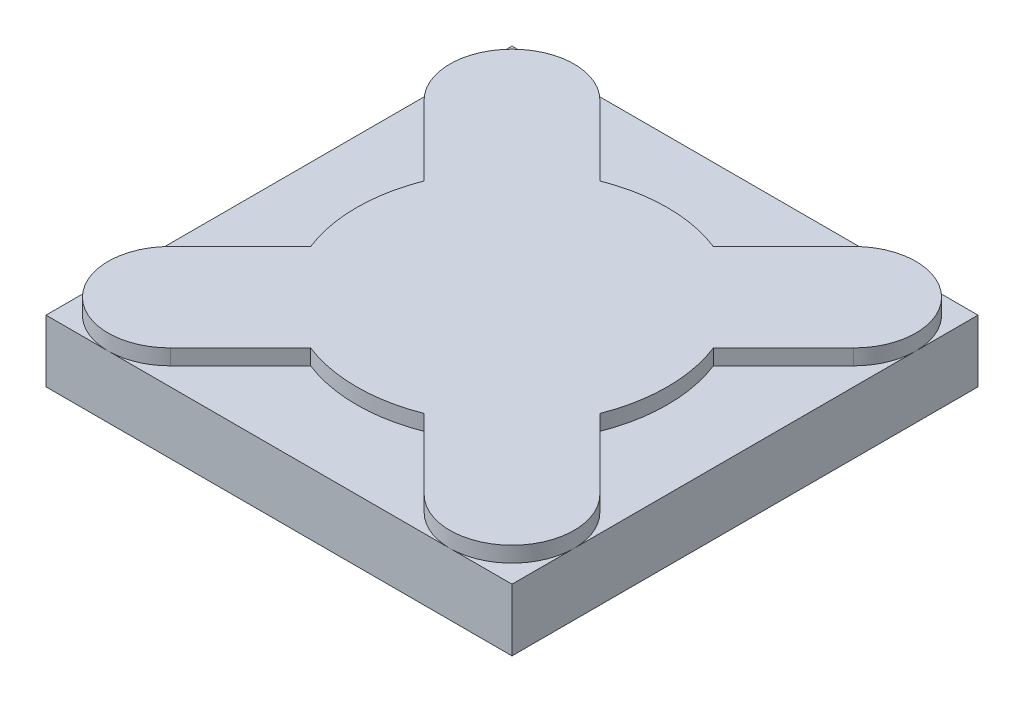
ISO-10303-21;
HEADER;
FILE_DESCRIPTION(('STEP AP214'),'2;1');
FILE_NAME('part.step','',(''),(''),'','','');
FILE_SCHEMA(('AUTOMOTIVE_DESIGN { 1 0 10303 214 1 1 1 1 }'));
ENDSEC;
DATA;
#1=APPLICATION_CONTEXT('core data for automotive mechanical design processes');
#2=APPLICATION_PROTOCOL_DEFINITION('international standard','automotive_design',2000,#1);
#3=PRODUCT_CONTEXT('',#1,'mechanical');
#4=PRODUCT('Part','Part','',(#3));
#5=PRODUCT_RELATED_PRODUCT_CATEGORY('part','',(#4));
#6=PRODUCT_DEFINITION_FORMATION('','',#4);
#7=PRODUCT_DEFINITION_CONTEXT('part definition',#1,'design');
#8=PRODUCT_DEFINITION('design','',#6,#7);
#9=PRODUCT_DEFINITION_SHAPE('','',#8);
#10=(LENGTH_UNIT() NAMED_UNIT(*) SI_UNIT(.MILLI.,.METRE.));
#11=(NAMED_UNIT(*) PLANE_ANGLE_UNIT() SI_UNIT($,.RADIAN.));
#12=(NAMED_UNIT(*) SI_UNIT($,.STERADIAN.) SOLID_ANGLE_UNIT());
#13=UNCERTAINTY_MEASURE_WITH_UNIT(LENGTH_MEASURE(1.E-05),#10,'distance_accuracy_value','');
#14=(GEOMETRIC_REPRESENTATION_CONTEXT(3) GLOBAL_UNCERTAINTY_ASSIGNED_CONTEXT((#13)) GLOBAL_UNIT_ASSIGNED_CONTEXT((#10,
#11,#12)) REPRESENTATION_CONTEXT('',''));
#15=CARTESIAN_POINT('',(0.,0.,0.));
#16=DIRECTION('',(0.,0.,1.));
#17=DIRECTION('',(1.,0.,0.));
#18=AXIS2_PLACEMENT_3D('',#15,#16,#17);
#19=CARTESIAN_POINT('',(0.,0.,0.));
#20=DIRECTION('',(0.,-1.,0.));
#21=DIRECTION('',(0.,0.,-1.));
#22=AXIS2_PLACEMENT_3D('',#19,#20,#21);
#23=PLANE('',#22);
#24=CARTESIAN_POINT('',(13.97,0.,-13.97));
#25=DIRECTION('',(0.,1.,0.));
#26=DIRECTION('',(0.,0.,1.));
#27=AXIS2_PLACEMENT_3D('',#24,#25,#26);
#28=CIRCLE('',#27,5.08);
#29=CARTESIAN_POINT('',(13.97,0.,-19.05));
#30=VERTEX_POINT('',#29);
#31=CARTESIAN_POINT('',(10.3778975515723,0.,-17.5621024484277));
#32=VERTEX_POINT('',#31);
#33=EDGE_CURVE('E11',#30,#32,#28,.T.);
#34=ORIENTED_EDGE('',*,*,#33,.F.);
#35=DIRECTION('',(-1.,0.,0.));
#36=VECTOR('',#35,1.);
#37=CARTESIAN_POINT('',(-19.05,0.,-19.05));
#38=LINE('',#37,#36);
#39=CARTESIAN_POINT('',(-13.97,0.,-19.05));
#40=VERTEX_POINT('',#39);
#41=EDGE_CURVE('E271',#30,#40,#38,.T.);
#42=ORIENTED_EDGE('',*,*,#41,.T.);
#43=CARTESIAN_POINT('',(-13.97,0.,-13.97));
#44=DIRECTION('',(0.,1.,0.));
#45=DIRECTION('',(0.,0.,1.));
#46=AXIS2_PLACEMENT_3D('',#43,#44,#45);
#47=CIRCLE('',#46,5.08);
#48=CARTESIAN_POINT('',(-10.3778975515723,0.,-17.5621024484277));
#49=VERTEX_POINT('',#48);
#50=EDGE_CURVE('E516',#49,#40,#47,.T.);
#51=ORIENTED_EDGE('',*,*,#50,.F.);
#52=DIRECTION('',(-0.707106781186546,0.,-0.707106781186548));
#53=VECTOR('',#52,1.);
#54=CARTESIAN_POINT('',(-10.3778975515723,0.,-17.5621024484277));
#55=LINE('',#54,#53);
#56=CARTESIAN_POINT('',(-4.63843823855033,0.,-11.8226431354056));
#57=VERTEX_POINT('',#56);
#58=EDGE_CURVE('E519',#57,#49,#55,.T.);
#59=ORIENTED_EDGE('',*,*,#58,.F.);
#60=CARTESIAN_POINT('',(0.,0.,0.));
#61=DIRECTION('',(0.,1.,0.));
#62=DIRECTION('',(0.,0.,1.));
#63=AXIS2_PLACEMENT_3D('',#60,#61,#62);
#64=CIRCLE('',#63,12.7);
#65=CARTESIAN_POINT('',(4.63843823855028,0.,-11.8226431354056));
#66=VERTEX_POINT('',#65);
#67=EDGE_CURVE('E68',#66,#57,#64,.T.);
#68=ORIENTED_EDGE('',*,*,#67,.F.);
#69=DIRECTION('',(-0.70710678118655,0.,0.707106781186545));
#70=VECTOR('',#69,1.);
#71=CARTESIAN_POINT('',(10.3778975515723,0.,-17.5621024484277));
#72=LINE('',#71,#70);
#73=EDGE_CURVE('E64',#32,#66,#72,.T.);
#74=ORIENTED_EDGE('',*,*,#73,.F.);
#75=EDGE_LOOP('',(#34,#42,#51,#59,#68,#74));
#76=FACE_BOUND('',#75,.T.);
#77=ADVANCED_FACE('F45',(#76),#23,.F.);
#78=CARTESIAN_POINT('',(19.05,0.,-13.97));
#79=VERTEX_POINT('',#78);
#80=EDGE_CURVE('E55',#79,#30,#28,.T.);
#81=ORIENTED_EDGE('',*,*,#80,.F.);
#82=DIRECTION('',(0.,0.,-1.));
#83=VECTOR('',#82,1.);
#84=CARTESIAN_POINT('',(19.05,0.,19.05));
#85=LINE('',#84,#83);
#86=CARTESIAN_POINT('',(19.05,0.,-19.05));
#87=VERTEX_POINT('',#86);
#88=EDGE_CURVE('E235',#79,#87,#85,.T.);
#89=ORIENTED_EDGE('',*,*,#88,.T.);
#90=EDGE_CURVE('E266',#87,#30,#38,.T.);
#91=ORIENTED_EDGE('',*,*,#90,.T.);
#92=EDGE_LOOP('',(#81,#89,#91));
#93=FACE_BOUND('',#92,.T.);
#94=ADVANCED_FACE('F311',(#93),#23,.F.);
#95=CARTESIAN_POINT('',(17.5621024484277,0.,-10.3778975515723));
#96=VERTEX_POINT('',#95);
#97=EDGE_CURVE('E57',#96,#79,#28,.T.);
#98=ORIENTED_EDGE('',*,*,#97,.F.);
#99=DIRECTION('',(0.707106781186545,0.,-0.70710678118655));
#100=VECTOR('',#99,1.);
#101=CARTESIAN_POINT('',(17.5621024484277,0.,-10.3778975515723));
#102=LINE('',#101,#100);
#103=CARTESIAN_POINT('',(11.8226431354057,0.,-4.63843823855029));
#104=VERTEX_POINT('',#103);
#105=EDGE_CURVE('E328',#104,#96,#102,.T.);
#106=ORIENTED_EDGE('',*,*,#105,.F.);
#107=CARTESIAN_POINT('',(0.,0.,0.));
#108=DIRECTION('',(0.,1.,0.));
#109=DIRECTION('',(0.,0.,1.));
#110=AXIS2_PLACEMENT_3D('',#107,#108,#109);
#111=CIRCLE('',#110,12.7);
#112=CARTESIAN_POINT('',(11.8226431354057,0.,4.63843823855031));
#113=VERTEX_POINT('',#112);
#114=EDGE_CURVE('E332',#113,#104,#111,.T.);
#115=ORIENTED_EDGE('',*,*,#114,.F.);
#116=DIRECTION('',(-0.707106781186546,0.,-0.707106781186549));
#117=VECTOR('',#116,1.);
#118=CARTESIAN_POINT('',(11.8226431354057,0.,4.63843823855031));
#119=LINE('',#118,#117);
#120=CARTESIAN_POINT('',(17.5621024484277,0.,10.3778975515723));
#121=VERTEX_POINT('',#120);
#122=EDGE_CURVE('E338',#121,#113,#119,.T.);
#123=ORIENTED_EDGE('',*,*,#122,.F.);
#124=CARTESIAN_POINT('',(13.97,0.,13.97));
#125=DIRECTION('',(0.,1.,0.));
#126=DIRECTION('',(0.,0.,-1.));
#127=AXIS2_PLACEMENT_3D('',#124,#125,#126);
#128=CIRCLE('',#127,5.08);
#129=CARTESIAN_POINT('',(19.05,0.,13.97));
#130=VERTEX_POINT('',#129);
#131=EDGE_CURVE('E319',#130,#121,#128,.T.);
#132=ORIENTED_EDGE('',*,*,#131,.F.);
#133=EDGE_CURVE('E239',#130,#79,#85,.T.);
#134=ORIENTED_EDGE('',*,*,#133,.T.);
#135=EDGE_LOOP('',(#98,#106,#115,#123,#132,#134));
#136=FACE_BOUND('',#135,.T.);
#137=ADVANCED_FACE('F544',(#136),#23,.F.);
#138=CARTESIAN_POINT('',(13.97,0.,19.05));
#139=VERTEX_POINT('',#138);
#140=EDGE_CURVE('E322',#139,#130,#128,.T.);
#141=ORIENTED_EDGE('',*,*,#140,.F.);
#142=DIRECTION('',(1.,0.,0.));
#143=VECTOR('',#142,1.);
#144=CARTESIAN_POINT('',(-19.05,0.,19.05));
#145=LINE('',#144,#143);
#146=CARTESIAN_POINT('',(19.05,0.,19.05));
#147=VERTEX_POINT('',#146);
#148=EDGE_CURVE('E276',#139,#147,#145,.T.);
#149=ORIENTED_EDGE('',*,*,#148,.T.);
#150=EDGE_CURVE('E241',#147,#130,#85,.T.);
#151=ORIENTED_EDGE('',*,*,#150,.T.);
#152=EDGE_LOOP('',(#141,#149,#151));
#153=FACE_BOUND('',#152,.T.);
#154=ADVANCED_FACE('F546',(#153),#23,.F.);
#155=CARTESIAN_POINT('',(-19.05,0.,-13.97));
#156=VERTEX_POINT('',#155);
#157=EDGE_CURVE('E517',#40,#156,#47,.T.);
#158=ORIENTED_EDGE('',*,*,#157,.F.);
#159=CARTESIAN_POINT('',(-19.05,0.,-19.05));
#160=VERTEX_POINT('',#159);
#161=EDGE_CURVE('E265',#40,#160,#38,.T.);
#162=ORIENTED_EDGE('',*,*,#161,.T.);
#163=DIRECTION('',(0.,0.,1.));
#164=VECTOR('',#163,1.);
#165=CARTESIAN_POINT('',(-19.05,0.,19.05));
#166=LINE('',#165,#164);
#167=EDGE_CURVE('E272',#160,#156,#166,.T.);
#168=ORIENTED_EDGE('',*,*,#167,.T.);
#169=EDGE_LOOP('',(#158,#162,#168));
#170=FACE_BOUND('',#169,.T.);
#171=ADVANCED_FACE('F561',(#170),#23,.F.);
#172=CARTESIAN_POINT('',(-17.5621024484277,0.,-10.3778975515723));
#173=VERTEX_POINT('',#172);
#174=EDGE_CURVE('E498',#156,#173,#47,.T.);
#175=ORIENTED_EDGE('',*,*,#174,.F.);
#176=CARTESIAN_POINT('',(-19.05,0.,13.97));
#177=VERTEX_POINT('',#176);
#178=EDGE_CURVE('E277',#156,#177,#166,.T.);
#179=ORIENTED_EDGE('',*,*,#178,.T.);
#180=CARTESIAN_POINT('',(-13.97,0.,13.97));
#181=DIRECTION('',(0.,1.,0.));
#182=DIRECTION('',(0.,0.,-1.));
#183=AXIS2_PLACEMENT_3D('',#180,#181,#182);
#184=CIRCLE('',#183,5.08);
#185=CARTESIAN_POINT('',(-17.5621024484277,0.,10.3778975515723));
#186=VERTEX_POINT('',#185);
#187=EDGE_CURVE('E358',#186,#177,#184,.T.);
#188=ORIENTED_EDGE('',*,*,#187,.F.);
#189=DIRECTION('',(-0.707106781186548,0.,0.707106781186547));
#190=VECTOR('',#189,1.);
#191=CARTESIAN_POINT('',(-11.8226431354056,0.,4.63843823855032));
#192=LINE('',#191,#190);
#193=CARTESIAN_POINT('',(-11.8226431354056,0.,4.63843823855032));
#194=VERTEX_POINT('',#193);
#195=EDGE_CURVE('E362',#194,#186,#192,.T.);
#196=ORIENTED_EDGE('',*,*,#195,.F.);
#197=CARTESIAN_POINT('',(0.,0.,0.));
#198=DIRECTION('',(0.,1.,0.));
#199=DIRECTION('',(0.,0.,1.));
#200=AXIS2_PLACEMENT_3D('',#197,#198,#199);
#201=CIRCLE('',#200,12.7);
#202=CARTESIAN_POINT('',(-11.8226431354056,0.,-4.63843823855032));
#203=VERTEX_POINT('',#202);
#204=EDGE_CURVE('E233',#203,#194,#201,.T.);
#205=ORIENTED_EDGE('',*,*,#204,.F.);
#206=DIRECTION('',(0.707106781186547,0.,0.707106781186548));
#207=VECTOR('',#206,1.);
#208=CARTESIAN_POINT('',(-17.5621024484277,0.,-10.3778975515723));
#209=LINE('',#208,#207);
#210=EDGE_CURVE('E230',#173,#203,#209,.T.);
#211=ORIENTED_EDGE('',*,*,#210,.F.);
#212=EDGE_LOOP('',(#175,#179,#188,#196,#205,#211));
#213=FACE_BOUND('',#212,.T.);
#214=ADVANCED_FACE('F537',(#213),#23,.F.);
#215=CARTESIAN_POINT('',(10.3778975515723,0.,17.5621024484277));
#216=VERTEX_POINT('',#215);
#217=EDGE_CURVE('E324',#216,#139,#128,.T.);
#218=ORIENTED_EDGE('',*,*,#217,.F.);
#219=DIRECTION('',(0.70710678118655,0.,0.707106781186544));
#220=VECTOR('',#219,1.);
#221=CARTESIAN_POINT('',(4.63843823855028,0.,11.8226431354056));
#222=LINE('',#221,#220);
#223=CARTESIAN_POINT('',(4.63843823855028,0.,11.8226431354057));
#224=VERTEX_POINT('',#223);
#225=EDGE_CURVE('E346',#224,#216,#222,.T.);
#226=ORIENTED_EDGE('',*,*,#225,.F.);
#227=CARTESIAN_POINT('',(0.,0.,0.));
#228=DIRECTION('',(0.,1.,0.));
#229=DIRECTION('',(0.,0.,1.));
#230=AXIS2_PLACEMENT_3D('',#227,#228,#229);
#231=CIRCLE('',#230,12.7);
#232=CARTESIAN_POINT('',(-4.63843823855028,0.,11.8226431354057));
#233=VERTEX_POINT('',#232);
#234=EDGE_CURVE('E350',#233,#224,#231,.T.);
#235=ORIENTED_EDGE('',*,*,#234,.F.);
#236=DIRECTION('',(0.707106781186551,0.,-0.707106781186544));
#237=VECTOR('',#236,1.);
#238=CARTESIAN_POINT('',(-4.63843823855028,0.,11.8226431354057));
#239=LINE('',#238,#237);
#240=CARTESIAN_POINT('',(-10.3778975515723,0.,17.5621024484277));
#241=VERTEX_POINT('',#240);
#242=EDGE_CURVE('E354',#241,#233,#239,.T.);
#243=ORIENTED_EDGE('',*,*,#242,.F.);
#244=CARTESIAN_POINT('',(-13.97,0.,19.05));
#245=VERTEX_POINT('',#244);
#246=EDGE_CURVE('E363',#245,#241,#184,.T.);
#247=ORIENTED_EDGE('',*,*,#246,.F.);
#248=EDGE_CURVE('E281',#245,#139,#145,.T.);
#249=ORIENTED_EDGE('',*,*,#248,.T.);
#250=EDGE_LOOP('',(#218,#226,#235,#243,#247,#249));
#251=FACE_BOUND('',#250,.T.);
#252=ADVANCED_FACE('F551',(#251),#23,.F.);
#253=EDGE_CURVE('E286',#177,#245,#184,.T.);
#254=ORIENTED_EDGE('',*,*,#253,.F.);
#255=CARTESIAN_POINT('',(-19.05,0.,19.05));
#256=VERTEX_POINT('',#255);
#257=EDGE_CURVE('E270',#177,#256,#166,.T.);
#258=ORIENTED_EDGE('',*,*,#257,.T.);
#259=EDGE_CURVE('E251',#256,#245,#145,.T.);
#260=ORIENTED_EDGE('',*,*,#259,.T.);
#261=EDGE_LOOP('',(#254,#258,#260));
#262=FACE_BOUND('',#261,.T.);
#263=ADVANCED_FACE('F529',(#262),#23,.F.);
#264=CARTESIAN_POINT('',(19.05,-5.08,19.05));
#265=DIRECTION('',(1.,0.,0.));
#266=DIRECTION('',(0.,0.,-1.));
#267=AXIS2_PLACEMENT_3D('',#264,#265,#266);
#268=PLANE('',#267);
#269=ORIENTED_EDGE('',*,*,#150,.F.);
#270=DIRECTION('',(0.,1.,0.));
#271=VECTOR('',#270,1.);
#272=CARTESIAN_POINT('',(19.05,-5.08,19.05));
#273=LINE('',#272,#271);
#274=CARTESIAN_POINT('',(19.05,-5.08,19.05));
#275=VERTEX_POINT('',#274);
#276=EDGE_CURVE('E282',#275,#147,#273,.T.);
#277=ORIENTED_EDGE('',*,*,#276,.F.);
#278=DIRECTION('',(0.,0.,-1.));
#279=VECTOR('',#278,1.);
#280=CARTESIAN_POINT('',(19.05,-5.08,19.05));
#281=LINE('',#280,#279);
#282=CARTESIAN_POINT('',(19.05,-5.08,-19.05));
#283=VERTEX_POINT('',#282);
#284=EDGE_CURVE('E246',#275,#283,#281,.T.);
#285=ORIENTED_EDGE('',*,*,#284,.T.);
#286=DIRECTION('',(0.,1.,0.));
#287=VECTOR('',#286,1.);
#288=CARTESIAN_POINT('',(19.05,-5.08,-19.05));
#289=LINE('',#288,#287);
#290=EDGE_CURVE('E49',#283,#87,#289,.T.);
#291=ORIENTED_EDGE('',*,*,#290,.T.);
#292=ORIENTED_EDGE('',*,*,#88,.F.);
#293=ORIENTED_EDGE('',*,*,#133,.F.);
#294=EDGE_LOOP('',(#269,#277,#285,#291,#292,#293));
#295=FACE_BOUND('',#294,.T.);
#296=ADVANCED_FACE('F47',(#295),#268,.T.);
#297=CARTESIAN_POINT('',(-19.05,-5.08,19.05));
#298=DIRECTION('',(0.,0.,1.));
#299=DIRECTION('',(1.,0.,0.));
#300=AXIS2_PLACEMENT_3D('',#297,#298,#299);
#301=PLANE('',#300);
#302=ORIENTED_EDGE('',*,*,#259,.F.);
#303=DIRECTION('',(0.,1.,0.));
#304=VECTOR('',#303,1.);
#305=CARTESIAN_POINT('',(-19.05,-5.08,19.05));
#306=LINE('',#305,#304);
#307=CARTESIAN_POINT('',(-19.05,-5.08,19.05));
#308=VERTEX_POINT('',#307);
#309=EDGE_CURVE('E287',#308,#256,#306,.T.);
#310=ORIENTED_EDGE('',*,*,#309,.F.);
#311=DIRECTION('',(1.,0.,0.));
#312=VECTOR('',#311,1.);
#313=CARTESIAN_POINT('',(-19.05,-5.08,19.05));
#314=LINE('',#313,#312);
#315=EDGE_CURVE('E259',#308,#275,#314,.T.);
#316=ORIENTED_EDGE('',*,*,#315,.T.);
#317=ORIENTED_EDGE('',*,*,#276,.T.);
#318=ORIENTED_EDGE('',*,*,#148,.F.);
#319=ORIENTED_EDGE('',*,*,#248,.F.);
#320=EDGE_LOOP('',(#302,#310,#316,#317,#318,#319));
#321=FACE_BOUND('',#320,.T.);
#322=ADVANCED_FACE('F555',(#321),#301,.T.);
#323=CARTESIAN_POINT('',(-19.05,-5.08,19.05));
#324=DIRECTION('',(-1.,0.,0.));
#325=DIRECTION('',(0.,0.,1.));
#326=AXIS2_PLACEMENT_3D('',#323,#324,#325);
#327=PLANE('',#326);
#328=ORIENTED_EDGE('',*,*,#167,.F.);
#329=DIRECTION('',(0.,1.,0.));
#330=VECTOR('',#329,1.);
#331=CARTESIAN_POINT('',(-19.05,-5.08,-19.05));
#332=LINE('',#331,#330);
#333=CARTESIAN_POINT('',(-19.05,-5.08,-19.05));
#334=VERTEX_POINT('',#333);
#335=EDGE_CURVE('E290',#334,#160,#332,.T.);
#336=ORIENTED_EDGE('',*,*,#335,.F.);
#337=DIRECTION('',(0.,0.,1.));
#338=VECTOR('',#337,1.);
#339=CARTESIAN_POINT('',(-19.05,-5.08,19.05));
#340=LINE('',#339,#338);
#341=EDGE_CURVE('E255',#334,#308,#340,.T.);
#342=ORIENTED_EDGE('',*,*,#341,.T.);
#343=ORIENTED_EDGE('',*,*,#309,.T.);
#344=ORIENTED_EDGE('',*,*,#257,.F.);
#345=ORIENTED_EDGE('',*,*,#178,.F.);
#346=EDGE_LOOP('',(#328,#336,#342,#343,#344,#345));
#347=FACE_BOUND('',#346,.T.);
#348=ADVANCED_FACE('F534',(#347),#327,.T.);
#349=CARTESIAN_POINT('',(-19.05,-5.08,-19.05));
#350=DIRECTION('',(0.,0.,-1.));
#351=DIRECTION('',(-1.,0.,0.));
#352=AXIS2_PLACEMENT_3D('',#349,#350,#351);
#353=PLANE('',#352);
#354=ORIENTED_EDGE('',*,*,#90,.F.);
#355=ORIENTED_EDGE('',*,*,#290,.F.);
#356=DIRECTION('',(-1.,0.,0.));
#357=VECTOR('',#356,1.);
#358=CARTESIAN_POINT('',(-19.05,-5.08,-19.05));
#359=LINE('',#358,#357);
#360=EDGE_CURVE('E250',#283,#334,#359,.T.);
#361=ORIENTED_EDGE('',*,*,#360,.T.);
#362=ORIENTED_EDGE('',*,*,#335,.T.);
#363=ORIENTED_EDGE('',*,*,#161,.F.);
#364=ORIENTED_EDGE('',*,*,#41,.F.);
#365=EDGE_LOOP('',(#354,#355,#361,#362,#363,#364));
#366=FACE_BOUND('',#365,.T.);
#367=ADVANCED_FACE('F307',(#366),#353,.T.);
#368=CARTESIAN_POINT('',(0.,-5.08,0.));
#369=DIRECTION('',(0.,-1.,0.));
#370=DIRECTION('',(0.,0.,-1.));
#371=AXIS2_PLACEMENT_3D('',#368,#369,#370);
#372=PLANE('',#371);
#373=ORIENTED_EDGE('',*,*,#284,.F.);
#374=ORIENTED_EDGE('',*,*,#315,.F.);
#375=ORIENTED_EDGE('',*,*,#341,.F.);
#376=ORIENTED_EDGE('',*,*,#360,.F.);
#377=EDGE_LOOP('',(#373,#374,#375,#376));
#378=FACE_BOUND('',#377,.T.);
#379=ADVANCED_FACE('F558',(#378),#372,.T.);
#380=CARTESIAN_POINT('',(0.,1.27,0.));
#381=DIRECTION('',(0.,-1.,0.));
#382=DIRECTION('',(0.,0.,-1.));
#383=AXIS2_PLACEMENT_3D('',#380,#381,#382);
#384=CYLINDRICAL_SURFACE('',#383,12.7);
#385=ORIENTED_EDGE('',*,*,#204,.T.);
#386=DIRECTION('',(0.,-1.,0.));
#387=VECTOR('',#386,1.);
#388=CARTESIAN_POINT('',(-11.8226431354056,1.27,4.63843823855032));
#389=LINE('',#388,#387);
#390=CARTESIAN_POINT('',(-11.8226431354056,1.27,4.63843823855032));
#391=VERTEX_POINT('',#390);
#392=EDGE_CURVE('E212',#391,#194,#389,.T.);
#393=ORIENTED_EDGE('',*,*,#392,.F.);
#394=CARTESIAN_POINT('',(0.,1.27,0.));
#395=DIRECTION('',(0.,1.,0.));
#396=DIRECTION('',(0.,0.,1.));
#397=AXIS2_PLACEMENT_3D('',#394,#395,#396);
#398=CIRCLE('',#397,12.7);
#399=CARTESIAN_POINT('',(-11.8226431354056,1.27,-4.63843823855032));
#400=VERTEX_POINT('',#399);
#401=EDGE_CURVE('E220',#400,#391,#398,.T.);
#402=ORIENTED_EDGE('',*,*,#401,.F.);
#403=DIRECTION('',(0.,-1.,0.));
#404=VECTOR('',#403,1.);
#405=CARTESIAN_POINT('',(-11.8226431354056,1.27,-4.63843823855032));
#406=LINE('',#405,#404);
#407=EDGE_CURVE('E370',#400,#203,#406,.T.);
#408=ORIENTED_EDGE('',*,*,#407,.T.);
#409=EDGE_LOOP('',(#385,#393,#402,#408));
#410=FACE_BOUND('',#409,.T.);
#411=ADVANCED_FACE('F232',(#410),#384,.T.);
#412=CARTESIAN_POINT('',(-11.8226431354056,1.27,4.63843823855032));
#413=DIRECTION('',(0.707106781186547,0.,0.707106781186548));
#414=DIRECTION('',(0.707106781186548,0.,-0.707106781186547));
#415=AXIS2_PLACEMENT_3D('',#412,#413,#414);
#416=PLANE('',#415);
#417=ORIENTED_EDGE('',*,*,#195,.T.);
#418=DIRECTION('',(0.,-1.,0.));
#419=VECTOR('',#418,1.);
#420=CARTESIAN_POINT('',(-17.5621024484277,1.27,10.3778975515723));
#421=LINE('',#420,#419);
#422=CARTESIAN_POINT('',(-17.5621024484277,1.27,10.3778975515723));
#423=VERTEX_POINT('',#422);
#424=EDGE_CURVE('E215',#423,#186,#421,.T.);
#425=ORIENTED_EDGE('',*,*,#424,.F.);
#426=DIRECTION('',(-0.707106781186548,0.,0.707106781186547));
#427=VECTOR('',#426,1.);
#428=CARTESIAN_POINT('',(-11.8226431354056,1.27,4.63843823855032));
#429=LINE('',#428,#427);
#430=EDGE_CURVE('E207',#391,#423,#429,.T.);
#431=ORIENTED_EDGE('',*,*,#430,.F.);
#432=ORIENTED_EDGE('',*,*,#392,.T.);
#433=EDGE_LOOP('',(#417,#425,#431,#432));
#434=FACE_BOUND('',#433,.T.);
#435=ADVANCED_FACE('F210',(#434),#416,.F.);
#436=CARTESIAN_POINT('',(-13.97,1.27,13.97));
#437=DIRECTION('',(0.,-1.,0.));
#438=DIRECTION('',(0.,0.,-1.));
#439=AXIS2_PLACEMENT_3D('',#436,#437,#438);
#440=CYLINDRICAL_SURFACE('',#439,5.08);
#441=ORIENTED_EDGE('',*,*,#187,.T.);
#442=ORIENTED_EDGE('',*,*,#253,.T.);
#443=ORIENTED_EDGE('',*,*,#246,.T.);
#444=DIRECTION('',(0.,-1.,0.));
#445=VECTOR('',#444,1.);
#446=CARTESIAN_POINT('',(-10.3778975515723,1.27,17.5621024484277));
#447=LINE('',#446,#445);
#448=CARTESIAN_POINT('',(-10.3778975515723,1.27,17.5621024484277));
#449=VERTEX_POINT('',#448);
#450=EDGE_CURVE('E242',#449,#241,#447,.T.);
#451=ORIENTED_EDGE('',*,*,#450,.F.);
#452=CARTESIAN_POINT('',(-13.97,1.27,13.97));
#453=DIRECTION('',(0.,1.,0.));
#454=DIRECTION('',(0.,0.,-1.));
#455=AXIS2_PLACEMENT_3D('',#452,#453,#454);
#456=CIRCLE('',#455,5.08);
#457=EDGE_CURVE('E219',#423,#449,#456,.T.);
#458=ORIENTED_EDGE('',*,*,#457,.F.);
#459=ORIENTED_EDGE('',*,*,#424,.T.);
#460=EDGE_LOOP('',(#441,#442,#443,#451,#458,#459));
#461=FACE_BOUND('',#460,.T.);
#462=ADVANCED_FACE('F414',(#461),#440,.T.);
#463=CARTESIAN_POINT('',(-4.63843823855028,1.27,11.8226431354057));
#464=DIRECTION('',(-0.707106781186544,0.,-0.707106781186551));
#465=DIRECTION('',(-0.707106781186551,0.,0.707106781186544));
#466=AXIS2_PLACEMENT_3D('',#463,#464,#465);
#467=PLANE('',#466);
#468=ORIENTED_EDGE('',*,*,#242,.T.);
#469=DIRECTION('',(0.,-1.,0.));
#470=VECTOR('',#469,1.);
#471=CARTESIAN_POINT('',(-4.63843823855028,1.27,11.8226431354057));
#472=LINE('',#471,#470);
#473=CARTESIAN_POINT('',(-4.63843823855028,1.27,11.8226431354057));
#474=VERTEX_POINT('',#473);
#475=EDGE_CURVE('E418',#474,#233,#472,.T.);
#476=ORIENTED_EDGE('',*,*,#475,.F.);
#477=DIRECTION('',(0.707106781186551,0.,-0.707106781186544));
#478=VECTOR('',#477,1.);
#479=CARTESIAN_POINT('',(-4.63843823855028,1.27,11.8226431354057));
#480=LINE('',#479,#478);
#481=EDGE_CURVE('E404',#449,#474,#480,.T.);
#482=ORIENTED_EDGE('',*,*,#481,.F.);
#483=ORIENTED_EDGE('',*,*,#450,.T.);
#484=EDGE_LOOP('',(#468,#476,#482,#483));
#485=FACE_BOUND('',#484,.T.);
#486=ADVANCED_FACE('F419',(#485),#467,.F.);
#487=CARTESIAN_POINT('',(0.,1.27,0.));
#488=DIRECTION('',(0.,-1.,0.));
#489=DIRECTION('',(0.,0.,-1.));
#490=AXIS2_PLACEMENT_3D('',#487,#488,#489);
#491=CYLINDRICAL_SURFACE('',#490,12.7);
#492=ORIENTED_EDGE('',*,*,#234,.T.);
#493=DIRECTION('',(0.,-1.,0.));
#494=VECTOR('',#493,1.);
#495=CARTESIAN_POINT('',(4.63843823855028,1.27,11.8226431354057));
#496=LINE('',#495,#494);
#497=CARTESIAN_POINT('',(4.63843823855028,1.27,11.8226431354057));
#498=VERTEX_POINT('',#497);
#499=EDGE_CURVE('E424',#498,#224,#496,.T.);
#500=ORIENTED_EDGE('',*,*,#499,.F.);
#501=CARTESIAN_POINT('',(0.,1.27,0.));
#502=DIRECTION('',(0.,1.,0.));
#503=DIRECTION('',(0.,0.,1.));
#504=AXIS2_PLACEMENT_3D('',#501,#502,#503);
#505=CIRCLE('',#504,12.7);
#506=EDGE_CURVE('E401',#474,#498,#505,.T.);
#507=ORIENTED_EDGE('',*,*,#506,.F.);
#508=ORIENTED_EDGE('',*,*,#475,.T.);
#509=EDGE_LOOP('',(#492,#500,#507,#508));
#510=FACE_BOUND('',#509,.T.);
#511=ADVANCED_FACE('F427',(#510),#491,.T.);
#512=CARTESIAN_POINT('',(4.63843823855028,1.27,11.8226431354056));
#513=DIRECTION('',(0.707106781186545,0.,-0.707106781186551));
#514=DIRECTION('',(-0.707106781186551,0.,-0.707106781186545));
#515=AXIS2_PLACEMENT_3D('',#512,#513,#514);
#516=PLANE('',#515);
#517=ORIENTED_EDGE('',*,*,#225,.T.);
#518=DIRECTION('',(0.,-1.,0.));
#519=VECTOR('',#518,1.);
#520=CARTESIAN_POINT('',(10.3778975515723,1.27,17.5621024484277));
#521=LINE('',#520,#519);
#522=CARTESIAN_POINT('',(10.3778975515723,1.27,17.5621024484277));
#523=VERTEX_POINT('',#522);
#524=EDGE_CURVE('E435',#523,#216,#521,.T.);
#525=ORIENTED_EDGE('',*,*,#524,.F.);
#526=DIRECTION('',(0.70710678118655,0.,0.707106781186544));
#527=VECTOR('',#526,1.);
#528=CARTESIAN_POINT('',(4.63843823855028,1.27,11.8226431354056));
#529=LINE('',#528,#527);
#530=EDGE_CURVE('E398',#498,#523,#529,.T.);
#531=ORIENTED_EDGE('',*,*,#530,.F.);
#532=ORIENTED_EDGE('',*,*,#499,.T.);
#533=EDGE_LOOP('',(#517,#525,#531,#532));
#534=FACE_BOUND('',#533,.T.);
#535=ADVANCED_FACE('F436',(#534),#516,.F.);
#536=CARTESIAN_POINT('',(13.97,1.27,13.97));
#537=DIRECTION('',(0.,-1.,0.));
#538=DIRECTION('',(0.,0.,-1.));
#539=AXIS2_PLACEMENT_3D('',#536,#537,#538);
#540=CYLINDRICAL_SURFACE('',#539,5.08);
#541=ORIENTED_EDGE('',*,*,#217,.T.);
#542=ORIENTED_EDGE('',*,*,#140,.T.);
#543=ORIENTED_EDGE('',*,*,#131,.T.);
#544=DIRECTION('',(0.,-1.,0.));
#545=VECTOR('',#544,1.);
#546=CARTESIAN_POINT('',(17.5621024484277,1.27,10.3778975515723));
#547=LINE('',#546,#545);
#548=CARTESIAN_POINT('',(17.5621024484277,1.27,10.3778975515723));
#549=VERTEX_POINT('',#548);
#550=EDGE_CURVE('E439',#549,#121,#547,.T.);
#551=ORIENTED_EDGE('',*,*,#550,.F.);
#552=CARTESIAN_POINT('',(13.97,1.27,13.97));
#553=DIRECTION('',(0.,1.,0.));
#554=DIRECTION('',(0.,0.,-1.));
#555=AXIS2_PLACEMENT_3D('',#552,#553,#554);
#556=CIRCLE('',#555,5.08);
#557=EDGE_CURVE('E395',#523,#549,#556,.T.);
#558=ORIENTED_EDGE('',*,*,#557,.F.);
#559=ORIENTED_EDGE('',*,*,#524,.T.);
#560=EDGE_LOOP('',(#541,#542,#543,#551,#558,#559));
#561=FACE_BOUND('',#560,.T.);
#562=ADVANCED_FACE('F441',(#561),#540,.T.);
#563=CARTESIAN_POINT('',(11.8226431354057,1.27,4.63843823855031));
#564=DIRECTION('',(-0.707106781186549,0.,0.707106781186546));
#565=DIRECTION('',(0.707106781186546,0.,0.707106781186549));
#566=AXIS2_PLACEMENT_3D('',#563,#564,#565);
#567=PLANE('',#566);
#568=ORIENTED_EDGE('',*,*,#122,.T.);
#569=DIRECTION('',(0.,-1.,0.));
#570=VECTOR('',#569,1.);
#571=CARTESIAN_POINT('',(11.8226431354057,1.27,4.63843823855031));
#572=LINE('',#571,#570);
#573=CARTESIAN_POINT('',(11.8226431354057,1.27,4.63843823855031));
#574=VERTEX_POINT('',#573);
#575=EDGE_CURVE('E447',#574,#113,#572,.T.);
#576=ORIENTED_EDGE('',*,*,#575,.F.);
#577=DIRECTION('',(-0.707106781186546,0.,-0.707106781186549));
#578=VECTOR('',#577,1.);
#579=CARTESIAN_POINT('',(11.8226431354057,1.27,4.63843823855031));
#580=LINE('',#579,#578);
#581=EDGE_CURVE('E392',#549,#574,#580,.T.);
#582=ORIENTED_EDGE('',*,*,#581,.F.);
#583=ORIENTED_EDGE('',*,*,#550,.T.);
#584=EDGE_LOOP('',(#568,#576,#582,#583));
#585=FACE_BOUND('',#584,.T.);
#586=ADVANCED_FACE('F450',(#585),#567,.F.);
#587=CARTESIAN_POINT('',(0.,1.27,0.));
#588=DIRECTION('',(0.,-1.,0.));
#589=DIRECTION('',(0.,0.,-1.));
#590=AXIS2_PLACEMENT_3D('',#587,#588,#589);
#591=CYLINDRICAL_SURFACE('',#590,12.7);
#592=ORIENTED_EDGE('',*,*,#114,.T.);
#593=DIRECTION('',(0.,-1.,0.));
#594=VECTOR('',#593,1.);
#595=CARTESIAN_POINT('',(11.8226431354057,1.27,-4.63843823855029));
#596=LINE('',#595,#594);
#597=CARTESIAN_POINT('',(11.8226431354057,1.27,-4.63843823855029));
#598=VERTEX_POINT('',#597);
#599=EDGE_CURVE('E456',#598,#104,#596,.T.);
#600=ORIENTED_EDGE('',*,*,#599,.F.);
#601=CARTESIAN_POINT('',(0.,1.27,0.));
#602=DIRECTION('',(0.,1.,0.));
#603=DIRECTION('',(0.,0.,1.));
#604=AXIS2_PLACEMENT_3D('',#601,#602,#603);
#605=CIRCLE('',#604,12.7);
#606=EDGE_CURVE('E389',#574,#598,#605,.T.);
#607=ORIENTED_EDGE('',*,*,#606,.F.);
#608=ORIENTED_EDGE('',*,*,#575,.T.);
#609=EDGE_LOOP('',(#592,#600,#607,#608));
#610=FACE_BOUND('',#609,.T.);
#611=ADVANCED_FACE('F457',(#610),#591,.T.);
#612=CARTESIAN_POINT('',(17.5621024484277,1.27,-10.3778975515723));
#613=DIRECTION('',(-0.70710678118655,0.,-0.707106781186545));
#614=DIRECTION('',(-0.707106781186545,0.,0.70710678118655));
#615=AXIS2_PLACEMENT_3D('',#612,#613,#614);
#616=PLANE('',#615);
#617=ORIENTED_EDGE('',*,*,#105,.T.);
#618=DIRECTION('',(0.,-1.,0.));
#619=VECTOR('',#618,1.);
#620=CARTESIAN_POINT('',(17.5621024484277,1.27,-10.3778975515723));
#621=LINE('',#620,#619);
#622=CARTESIAN_POINT('',(17.5621024484277,1.27,-10.3778975515723));
#623=VERTEX_POINT('',#622);
#624=EDGE_CURVE('E459',#623,#96,#621,.T.);
#625=ORIENTED_EDGE('',*,*,#624,.F.);
#626=DIRECTION('',(0.707106781186545,0.,-0.70710678118655));
#627=VECTOR('',#626,1.);
#628=CARTESIAN_POINT('',(17.5621024484277,1.27,-10.3778975515723));
#629=LINE('',#628,#627);
#630=EDGE_CURVE('E386',#598,#623,#629,.T.);
#631=ORIENTED_EDGE('',*,*,#630,.F.);
#632=ORIENTED_EDGE('',*,*,#599,.T.);
#633=EDGE_LOOP('',(#617,#625,#631,#632));
#634=FACE_BOUND('',#633,.T.);
#635=ADVANCED_FACE('F461',(#634),#616,.F.);
#636=CARTESIAN_POINT('',(13.97,1.27,-13.97));
#637=DIRECTION('',(0.,-1.,0.));
#638=DIRECTION('',(0.,0.,-1.));
#639=AXIS2_PLACEMENT_3D('',#636,#637,#638);
#640=CYLINDRICAL_SURFACE('',#639,5.08);
#641=ORIENTED_EDGE('',*,*,#97,.T.);
#642=ORIENTED_EDGE('',*,*,#80,.T.);
#643=ORIENTED_EDGE('',*,*,#33,.T.);
#644=DIRECTION('',(0.,-1.,0.));
#645=VECTOR('',#644,1.);
#646=CARTESIAN_POINT('',(10.3778975515723,1.27,-17.5621024484277));
#647=LINE('',#646,#645);
#648=CARTESIAN_POINT('',(10.3778975515723,1.27,-17.5621024484277));
#649=VERTEX_POINT('',#648);
#650=EDGE_CURVE('E464',#649,#32,#647,.T.);
#651=ORIENTED_EDGE('',*,*,#650,.F.);
#652=CARTESIAN_POINT('',(13.97,1.27,-13.97));
#653=DIRECTION('',(0.,1.,0.));
#654=DIRECTION('',(0.,0.,1.));
#655=AXIS2_PLACEMENT_3D('',#652,#653,#654);
#656=CIRCLE('',#655,5.08);
#657=EDGE_CURVE('E383',#623,#649,#656,.T.);
#658=ORIENTED_EDGE('',*,*,#657,.F.);
#659=ORIENTED_EDGE('',*,*,#624,.T.);
#660=EDGE_LOOP('',(#641,#642,#643,#651,#658,#659));
#661=FACE_BOUND('',#660,.T.);
#662=ADVANCED_FACE('F314',(#661),#640,.T.);
#663=CARTESIAN_POINT('',(10.3778975515723,1.27,-17.5621024484277));
#664=DIRECTION('',(0.707106781186545,0.,0.70710678118655));
#665=DIRECTION('',(0.70710678118655,0.,-0.707106781186545));
#666=AXIS2_PLACEMENT_3D('',#663,#664,#665);
#667=PLANE('',#666);
#668=ORIENTED_EDGE('',*,*,#73,.T.);
#669=DIRECTION('',(0.,-1.,0.));
#670=VECTOR('',#669,1.);
#671=CARTESIAN_POINT('',(4.63843823855028,1.27,-11.8226431354056));
#672=LINE('',#671,#670);
#673=CARTESIAN_POINT('',(4.63843823855028,1.27,-11.8226431354056));
#674=VERTEX_POINT('',#673);
#675=EDGE_CURVE('E472',#674,#66,#672,.T.);
#676=ORIENTED_EDGE('',*,*,#675,.F.);
#677=DIRECTION('',(-0.70710678118655,0.,0.707106781186545));
#678=VECTOR('',#677,1.);
#679=CARTESIAN_POINT('',(10.3778975515723,1.27,-17.5621024484277));
#680=LINE('',#679,#678);
#681=EDGE_CURVE('E380',#649,#674,#680,.T.);
#682=ORIENTED_EDGE('',*,*,#681,.F.);
#683=ORIENTED_EDGE('',*,*,#650,.T.);
#684=EDGE_LOOP('',(#668,#676,#682,#683));
#685=FACE_BOUND('',#684,.T.);
#686=ADVANCED_FACE('F473',(#685),#667,.F.);
#687=CARTESIAN_POINT('',(0.,1.27,0.));
#688=DIRECTION('',(0.,-1.,0.));
#689=DIRECTION('',(0.,0.,-1.));
#690=AXIS2_PLACEMENT_3D('',#687,#688,#689);
#691=CYLINDRICAL_SURFACE('',#690,12.7);
#692=ORIENTED_EDGE('',*,*,#67,.T.);
#693=DIRECTION('',(0.,-1.,0.));
#694=VECTOR('',#693,1.);
#695=CARTESIAN_POINT('',(-4.63843823855033,1.27,-11.8226431354056));
#696=LINE('',#695,#694);
#697=CARTESIAN_POINT('',(-4.63843823855033,1.27,-11.8226431354056));
#698=VERTEX_POINT('',#697);
#699=EDGE_CURVE('E476',#698,#57,#696,.T.);
#700=ORIENTED_EDGE('',*,*,#699,.F.);
#701=CARTESIAN_POINT('',(0.,1.27,0.));
#702=DIRECTION('',(0.,1.,0.));
#703=DIRECTION('',(0.,0.,1.));
#704=AXIS2_PLACEMENT_3D('',#701,#702,#703);
#705=CIRCLE('',#704,12.7);
#706=EDGE_CURVE('E377',#674,#698,#705,.T.);
#707=ORIENTED_EDGE('',*,*,#706,.F.);
#708=ORIENTED_EDGE('',*,*,#675,.T.);
#709=EDGE_LOOP('',(#692,#700,#707,#708));
#710=FACE_BOUND('',#709,.T.);
#711=ADVANCED_FACE('F478',(#710),#691,.T.);
#712=CARTESIAN_POINT('',(-10.3778975515723,1.27,-17.5621024484277));
#713=DIRECTION('',(-0.707106781186549,0.,0.707106781186547));
#714=DIRECTION('',(0.707106781186547,0.,0.707106781186549));
#715=AXIS2_PLACEMENT_3D('',#712,#713,#714);
#716=PLANE('',#715);
#717=ORIENTED_EDGE('',*,*,#58,.T.);
#718=DIRECTION('',(0.,-1.,0.));
#719=VECTOR('',#718,1.);
#720=CARTESIAN_POINT('',(-10.3778975515723,1.27,-17.5621024484277));
#721=LINE('',#720,#719);
#722=CARTESIAN_POINT('',(-10.3778975515723,1.27,-17.5621024484277));
#723=VERTEX_POINT('',#722);
#724=EDGE_CURVE('E484',#723,#49,#721,.T.);
#725=ORIENTED_EDGE('',*,*,#724,.F.);
#726=DIRECTION('',(-0.707106781186546,0.,-0.707106781186548));
#727=VECTOR('',#726,1.);
#728=CARTESIAN_POINT('',(-10.3778975515723,1.27,-17.5621024484277));
#729=LINE('',#728,#727);
#730=EDGE_CURVE('E374',#698,#723,#729,.T.);
#731=ORIENTED_EDGE('',*,*,#730,.F.);
#732=ORIENTED_EDGE('',*,*,#699,.T.);
#733=EDGE_LOOP('',(#717,#725,#731,#732));
#734=FACE_BOUND('',#733,.T.);
#735=ADVANCED_FACE('F487',(#734),#716,.F.);
#736=CARTESIAN_POINT('',(-13.97,1.27,-13.97));
#737=DIRECTION('',(0.,-1.,0.));
#738=DIRECTION('',(0.,0.,-1.));
#739=AXIS2_PLACEMENT_3D('',#736,#737,#738);
#740=CYLINDRICAL_SURFACE('',#739,5.08);
#741=ORIENTED_EDGE('',*,*,#50,.T.);
#742=ORIENTED_EDGE('',*,*,#157,.T.);
#743=ORIENTED_EDGE('',*,*,#174,.T.);
#744=DIRECTION('',(0.,-1.,0.));
#745=VECTOR('',#744,1.);
#746=CARTESIAN_POINT('',(-17.5621024484277,1.27,-10.3778975515723));
#747=LINE('',#746,#745);
#748=CARTESIAN_POINT('',(-17.5621024484277,1.27,-10.3778975515723));
#749=VERTEX_POINT('',#748);
#750=EDGE_CURVE('E494',#749,#173,#747,.T.);
#751=ORIENTED_EDGE('',*,*,#750,.F.);
#752=CARTESIAN_POINT('',(-13.97,1.27,-13.97));
#753=DIRECTION('',(0.,1.,0.));
#754=DIRECTION('',(0.,0.,1.));
#755=AXIS2_PLACEMENT_3D('',#752,#753,#754);
#756=CIRCLE('',#755,5.08);
#757=EDGE_CURVE('E371',#723,#749,#756,.T.);
#758=ORIENTED_EDGE('',*,*,#757,.F.);
#759=ORIENTED_EDGE('',*,*,#724,.T.);
#760=EDGE_LOOP('',(#741,#742,#743,#751,#758,#759));
#761=FACE_BOUND('',#760,.T.);
#762=ADVANCED_FACE('F496',(#761),#740,.T.);
#763=CARTESIAN_POINT('',(-17.5621024484277,1.27,-10.3778975515723));
#764=DIRECTION('',(0.707106781186548,0.,-0.707106781186547));
#765=DIRECTION('',(-0.707106781186547,0.,-0.707106781186548));
#766=AXIS2_PLACEMENT_3D('',#763,#764,#765);
#767=PLANE('',#766);
#768=ORIENTED_EDGE('',*,*,#210,.T.);
#769=ORIENTED_EDGE('',*,*,#407,.F.);
#770=DIRECTION('',(0.707106781186547,0.,0.707106781186548));
#771=VECTOR('',#770,1.);
#772=CARTESIAN_POINT('',(-17.5621024484277,1.27,-10.3778975515723));
#773=LINE('',#772,#771);
#774=EDGE_CURVE('E225',#749,#400,#773,.T.);
#775=ORIENTED_EDGE('',*,*,#774,.F.);
#776=ORIENTED_EDGE('',*,*,#750,.T.);
#777=EDGE_LOOP('',(#768,#769,#775,#776));
#778=FACE_BOUND('',#777,.T.);
#779=ADVANCED_FACE('F503',(#778),#767,.F.);
#780=CARTESIAN_POINT('',(0.,1.27,0.));
#781=DIRECTION('',(0.,1.,0.));
#782=DIRECTION('',(0.,0.,1.));
#783=AXIS2_PLACEMENT_3D('',#780,#781,#782);
#784=PLANE('',#783);
#785=ORIENTED_EDGE('',*,*,#401,.T.);
#786=ORIENTED_EDGE('',*,*,#430,.T.);
#787=ORIENTED_EDGE('',*,*,#457,.T.);
#788=ORIENTED_EDGE('',*,*,#481,.T.);
#789=ORIENTED_EDGE('',*,*,#506,.T.);
#790=ORIENTED_EDGE('',*,*,#530,.T.);
#791=ORIENTED_EDGE('',*,*,#557,.T.);
#792=ORIENTED_EDGE('',*,*,#581,.T.);
#793=ORIENTED_EDGE('',*,*,#606,.T.);
#794=ORIENTED_EDGE('',*,*,#630,.T.);
#795=ORIENTED_EDGE('',*,*,#657,.T.);
#796=ORIENTED_EDGE('',*,*,#681,.T.);
#797=ORIENTED_EDGE('',*,*,#706,.T.);
#798=ORIENTED_EDGE('',*,*,#730,.T.);
#799=ORIENTED_EDGE('',*,*,#757,.T.);
#800=ORIENTED_EDGE('',*,*,#774,.T.);
#801=EDGE_LOOP('',(#785,#786,#787,#788,#789,#790,#791,#792,#793,#794,#795,#796,#797,#798,#799,#800));
#802=FACE_BOUND('',#801,.T.);
#803=ADVANCED_FACE('F223',(#802),#784,.T.);
#804=CLOSED_SHELL('',(#77,#94,#137,#154,#171,#214,#252,#263,#296,#322,#348,#367,#379,#411,#435,
#462,#486,#511,#535,#562,#586,#611,#635,#662,#686,#711,#735,#762,#779,#803));
#805=MANIFOLD_SOLID_BREP('B2',#804);
#806=ADVANCED_BREP_SHAPE_REPRESENTATION('',(#18,#805),#14);
#807=SHAPE_DEFINITION_REPRESENTATION(#9,#806);
ENDSEC;
END-ISO-10303-21;
